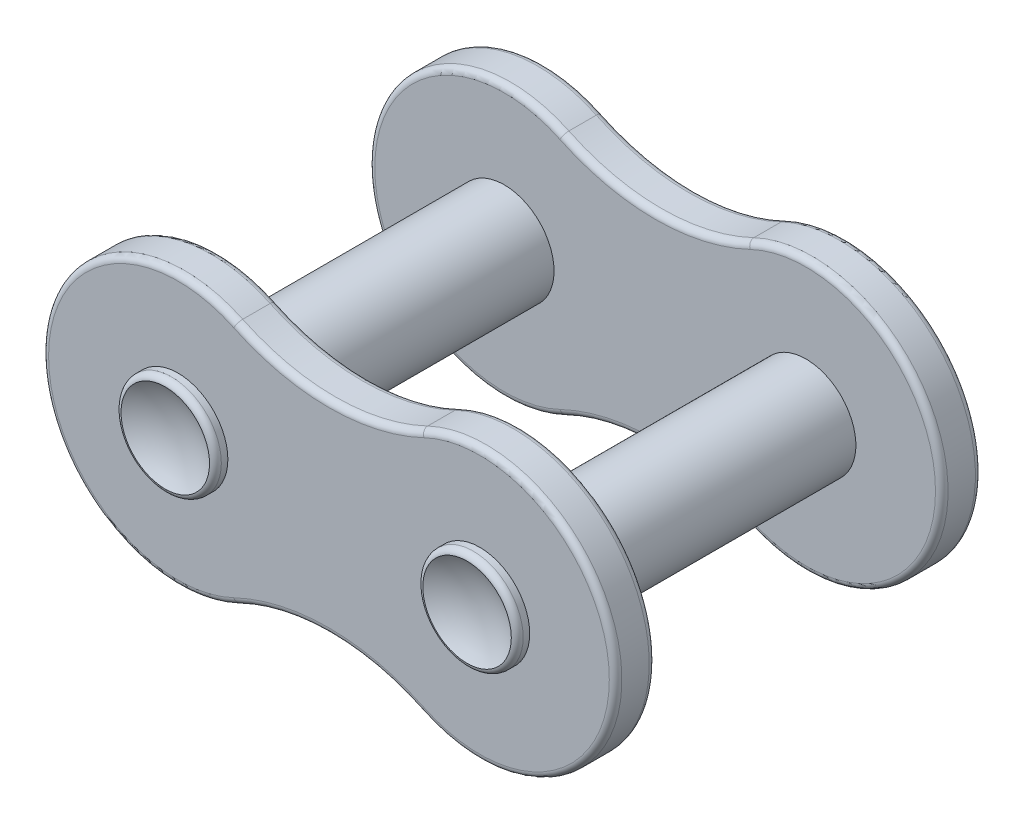
ISO-10303-21;
HEADER;
FILE_DESCRIPTION(('STEP AP214'),'2;1');
FILE_NAME('part.step','',(''),(''),'','','');
FILE_SCHEMA(('AUTOMOTIVE_DESIGN { 1 0 10303 214 1 1 1 1 }'));
ENDSEC;
DATA;
#1=APPLICATION_CONTEXT('core data for automotive mechanical design processes');
#2=APPLICATION_PROTOCOL_DEFINITION('international standard','automotive_design',2000,#1);
#3=PRODUCT_CONTEXT('',#1,'mechanical');
#4=PRODUCT('Part','Part','',(#3));
#5=PRODUCT_RELATED_PRODUCT_CATEGORY('part','',(#4));
#6=PRODUCT_DEFINITION_FORMATION('','',#4);
#7=PRODUCT_DEFINITION_CONTEXT('part definition',#1,'design');
#8=PRODUCT_DEFINITION('design','',#6,#7);
#9=PRODUCT_DEFINITION_SHAPE('','',#8);
#10=(LENGTH_UNIT() NAMED_UNIT(*) SI_UNIT(.MILLI.,.METRE.));
#11=(NAMED_UNIT(*) PLANE_ANGLE_UNIT() SI_UNIT($,.RADIAN.));
#12=(NAMED_UNIT(*) SI_UNIT($,.STERADIAN.) SOLID_ANGLE_UNIT());
#13=UNCERTAINTY_MEASURE_WITH_UNIT(LENGTH_MEASURE(1.E-05),#10,'distance_accuracy_value','');
#14=(GEOMETRIC_REPRESENTATION_CONTEXT(3) GLOBAL_UNCERTAINTY_ASSIGNED_CONTEXT((#13)) GLOBAL_UNIT_ASSIGNED_CONTEXT((#10,
#11,#12)) REPRESENTATION_CONTEXT('',''));
#15=CARTESIAN_POINT('',(0.,0.,0.));
#16=DIRECTION('',(0.,0.,1.));
#17=DIRECTION('',(1.,0.,0.));
#18=AXIS2_PLACEMENT_3D('',#15,#16,#17);
#19=CARTESIAN_POINT('',(3.,6.28966658193381,1.5875));
#20=DIRECTION('',(0.,0.,1.));
#21=DIRECTION('',(1.,0.,0.));
#22=AXIS2_PLACEMENT_3D('',#19,#20,#21);
#23=PLANE('',#22);
#24=CARTESIAN_POINT('',(-6.,0.,1.5875));
#25=DIRECTION('',(0.,0.,1.));
#26=DIRECTION('',(1.,0.,0.));
#27=AXIS2_PLACEMENT_3D('',#24,#25,#26);
#28=CIRCLE('',#27,5.1475);
#29=CARTESIAN_POINT('',(-3.78395440052328,4.64606265035674,1.5875));
#30=VERTEX_POINT('',#29);
#31=CARTESIAN_POINT('',(-3.78395440052328,-4.64606265035674,1.5875));
#32=VERTEX_POINT('',#31);
#33=EDGE_CURVE('E276',#30,#32,#28,.T.);
#34=ORIENTED_EDGE('',*,*,#33,.T.);
#35=CARTESIAN_POINT('',(0.,-12.5793331638676,1.5875));
#36=DIRECTION('',(0.,0.,1.));
#37=DIRECTION('',(1.,0.,0.));
#38=AXIS2_PLACEMENT_3D('',#35,#36,#37);
#39=CIRCLE('',#38,8.78948758152492);
#40=CARTESIAN_POINT('',(3.78395440052328,-4.64606265035674,1.5875));
#41=VERTEX_POINT('',#40);
#42=EDGE_CURVE('E278',#32,#41,#39,.F.);
#43=ORIENTED_EDGE('',*,*,#42,.T.);
#44=CARTESIAN_POINT('',(6.,0.,1.5875));
#45=DIRECTION('',(0.,0.,1.));
#46=DIRECTION('',(1.,0.,0.));
#47=AXIS2_PLACEMENT_3D('',#44,#45,#46);
#48=CIRCLE('',#47,5.1475);
#49=CARTESIAN_POINT('',(3.78395440052328,4.64606265035674,1.5875));
#50=VERTEX_POINT('',#49);
#51=EDGE_CURVE('E182',#41,#50,#48,.T.);
#52=ORIENTED_EDGE('',*,*,#51,.T.);
#53=CARTESIAN_POINT('',(0.,12.5793331638676,1.5875));
#54=DIRECTION('',(0.,0.,1.));
#55=DIRECTION('',(1.,0.,0.));
#56=AXIS2_PLACEMENT_3D('',#53,#54,#55);
#57=CIRCLE('',#56,8.78948758152492);
#58=EDGE_CURVE('E274',#50,#30,#57,.F.);
#59=ORIENTED_EDGE('',*,*,#58,.T.);
#60=EDGE_LOOP('',(#34,#43,#52,#59));
#61=FACE_BOUND('',#60,.T.);
#62=CARTESIAN_POINT('',(-6.,0.,1.5875));
#63=DIRECTION('',(0.,0.,1.));
#64=DIRECTION('',(1.,0.,0.));
#65=AXIS2_PLACEMENT_3D('',#62,#63,#64);
#66=CIRCLE('',#65,1.9812);
#67=CARTESIAN_POINT('',(-4.0188,0.,1.5875));
#68=VERTEX_POINT('',#67);
#69=EDGE_CURVE('E344',#68,#68,#66,.T.);
#70=ORIENTED_EDGE('',*,*,#69,.F.);
#71=EDGE_LOOP('',(#70));
#72=FACE_BOUND('',#71,.T.);
#73=CARTESIAN_POINT('',(6.,0.,1.5875));
#74=DIRECTION('',(0.,0.,1.));
#75=DIRECTION('',(-1.,0.,0.));
#76=AXIS2_PLACEMENT_3D('',#73,#74,#75);
#77=CIRCLE('',#76,1.9812);
#78=CARTESIAN_POINT('',(4.0188,0.,1.5875));
#79=VERTEX_POINT('',#78);
#80=EDGE_CURVE('E347',#79,#79,#77,.T.);
#81=ORIENTED_EDGE('',*,*,#80,.F.);
#82=EDGE_LOOP('',(#81));
#83=FACE_BOUND('',#82,.T.);
#84=ADVANCED_FACE('F32',(#61,#72,#83),#23,.T.);
#85=CARTESIAN_POINT('',(3.,6.28966658193381,0.));
#86=DIRECTION('',(0.,0.,1.));
#87=DIRECTION('',(1.,0.,0.));
#88=AXIS2_PLACEMENT_3D('',#85,#86,#87);
#89=PLANE('',#88);
#90=CARTESIAN_POINT('',(6.,0.,0.));
#91=DIRECTION('',(0.,0.,1.));
#92=DIRECTION('',(1.,0.,0.));
#93=AXIS2_PLACEMENT_3D('',#90,#91,#92);
#94=CIRCLE('',#93,5.1475);
#95=CARTESIAN_POINT('',(3.78395440052328,4.64606265035674,0.));
#96=VERTEX_POINT('',#95);
#97=CARTESIAN_POINT('',(3.78395440052328,-4.64606265035674,0.));
#98=VERTEX_POINT('',#97);
#99=EDGE_CURVE('E256',#96,#98,#94,.F.);
#100=ORIENTED_EDGE('',*,*,#99,.T.);
#101=CARTESIAN_POINT('',(0.,-12.5793331638676,0.));
#102=DIRECTION('',(0.,0.,1.));
#103=DIRECTION('',(1.,0.,0.));
#104=AXIS2_PLACEMENT_3D('',#101,#102,#103);
#105=CIRCLE('',#104,8.78948758152492);
#106=CARTESIAN_POINT('',(-3.78395440052328,-4.64606265035674,0.));
#107=VERTEX_POINT('',#106);
#108=EDGE_CURVE('E262',#98,#107,#105,.T.);
#109=ORIENTED_EDGE('',*,*,#108,.T.);
#110=CARTESIAN_POINT('',(-6.,0.,0.));
#111=DIRECTION('',(0.,0.,1.));
#112=DIRECTION('',(1.,0.,0.));
#113=AXIS2_PLACEMENT_3D('',#110,#111,#112);
#114=CIRCLE('',#113,5.1475);
#115=CARTESIAN_POINT('',(-3.78395440052328,4.64606265035674,0.));
#116=VERTEX_POINT('',#115);
#117=EDGE_CURVE('E260',#107,#116,#114,.F.);
#118=ORIENTED_EDGE('',*,*,#117,.T.);
#119=CARTESIAN_POINT('',(0.,12.5793331638676,0.));
#120=DIRECTION('',(0.,0.,1.));
#121=DIRECTION('',(1.,0.,0.));
#122=AXIS2_PLACEMENT_3D('',#119,#120,#121);
#123=CIRCLE('',#122,8.78948758152492);
#124=EDGE_CURVE('E258',#116,#96,#123,.T.);
#125=ORIENTED_EDGE('',*,*,#124,.T.);
#126=EDGE_LOOP('',(#100,#109,#118,#125));
#127=FACE_BOUND('',#126,.T.);
#128=CARTESIAN_POINT('',(-6.,0.,0.));
#129=DIRECTION('',(0.,0.,1.));
#130=DIRECTION('',(1.,0.,0.));
#131=AXIS2_PLACEMENT_3D('',#128,#129,#130);
#132=CIRCLE('',#131,1.9812);
#133=CARTESIAN_POINT('',(-4.0188,0.,0.));
#134=VERTEX_POINT('',#133);
#135=EDGE_CURVE('E373',#134,#134,#132,.T.);
#136=ORIENTED_EDGE('',*,*,#135,.T.);
#137=EDGE_LOOP('',(#136));
#138=FACE_BOUND('',#137,.T.);
#139=CARTESIAN_POINT('',(6.,0.,0.));
#140=DIRECTION('',(0.,0.,1.));
#141=DIRECTION('',(1.,0.,0.));
#142=AXIS2_PLACEMENT_3D('',#139,#140,#141);
#143=CIRCLE('',#142,1.9812);
#144=CARTESIAN_POINT('',(7.9812,0.,0.));
#145=VERTEX_POINT('',#144);
#146=EDGE_CURVE('E243',#145,#145,#143,.F.);
#147=ORIENTED_EDGE('',*,*,#146,.F.);
#148=EDGE_LOOP('',(#147));
#149=FACE_BOUND('',#148,.T.);
#150=ADVANCED_FACE('F332',(#127,#138,#149),#89,.F.);
#151=CARTESIAN_POINT('',(0.,12.5793331638676,1.5875));
#152=DIRECTION('',(0.,0.,-1.));
#153=DIRECTION('',(-1.,0.,0.));
#154=AXIS2_PLACEMENT_3D('',#151,#152,#153);
#155=CYLINDRICAL_SURFACE('',#154,8.53948758152492);
#156=DIRECTION('',(0.,0.,-1.));
#157=VECTOR('',#156,1.);
#158=CARTESIAN_POINT('',(3.6763271251723,4.87170920938329,1.5875));
#159=LINE('',#158,#157);
#160=CARTESIAN_POINT('',(3.6763271251723,4.87170920938329,1.3375));
#161=VERTEX_POINT('',#160);
#162=CARTESIAN_POINT('',(3.6763271251723,4.87170920938329,0.25));
#163=VERTEX_POINT('',#162);
#164=EDGE_CURVE('E151',#161,#163,#159,.T.);
#165=ORIENTED_EDGE('',*,*,#164,.T.);
#166=CARTESIAN_POINT('',(0.,12.5793331638676,0.25));
#167=DIRECTION('',(0.,0.,1.));
#168=DIRECTION('',(1.,0.,0.));
#169=AXIS2_PLACEMENT_3D('',#166,#167,#168);
#170=CIRCLE('',#169,8.53948758152492);
#171=CARTESIAN_POINT('',(-3.6763271251723,4.87170920938329,0.25));
#172=VERTEX_POINT('',#171);
#173=EDGE_CURVE('E271',#163,#172,#170,.F.);
#174=ORIENTED_EDGE('',*,*,#173,.T.);
#175=DIRECTION('',(0.,0.,-1.));
#176=VECTOR('',#175,1.);
#177=CARTESIAN_POINT('',(-3.6763271251723,4.87170920938329,1.5875));
#178=LINE('',#177,#176);
#179=CARTESIAN_POINT('',(-3.6763271251723,4.87170920938329,1.3375));
#180=VERTEX_POINT('',#179);
#181=EDGE_CURVE('E351',#180,#172,#178,.T.);
#182=ORIENTED_EDGE('',*,*,#181,.F.);
#183=CARTESIAN_POINT('',(0.,12.5793331638676,1.3375));
#184=DIRECTION('',(0.,0.,1.));
#185=DIRECTION('',(1.,0.,0.));
#186=AXIS2_PLACEMENT_3D('',#183,#184,#185);
#187=CIRCLE('',#186,8.53948758152492);
#188=EDGE_CURVE('E269',#180,#161,#187,.T.);
#189=ORIENTED_EDGE('',*,*,#188,.T.);
#190=EDGE_LOOP('',(#165,#174,#182,#189));
#191=FACE_BOUND('',#190,.T.);
#192=ADVANCED_FACE('F340',(#191),#155,.F.);
#193=CARTESIAN_POINT('',(-6.,0.,1.5875));
#194=DIRECTION('',(0.,0.,-1.));
#195=DIRECTION('',(-1.,0.,0.));
#196=AXIS2_PLACEMENT_3D('',#193,#194,#195);
#197=CYLINDRICAL_SURFACE('',#196,5.3975);
#198=ORIENTED_EDGE('',*,*,#181,.T.);
#199=CARTESIAN_POINT('',(-6.,0.,0.25));
#200=DIRECTION('',(0.,0.,1.));
#201=DIRECTION('',(1.,0.,0.));
#202=AXIS2_PLACEMENT_3D('',#199,#200,#201);
#203=CIRCLE('',#202,5.3975);
#204=CARTESIAN_POINT('',(-3.6763271251723,-4.87170920938329,0.25));
#205=VERTEX_POINT('',#204);
#206=EDGE_CURVE('E267',#172,#205,#203,.T.);
#207=ORIENTED_EDGE('',*,*,#206,.T.);
#208=DIRECTION('',(0.,0.,-1.));
#209=VECTOR('',#208,1.);
#210=CARTESIAN_POINT('',(-3.6763271251723,-4.87170920938329,1.5875));
#211=LINE('',#210,#209);
#212=CARTESIAN_POINT('',(-3.6763271251723,-4.87170920938329,1.3375));
#213=VERTEX_POINT('',#212);
#214=EDGE_CURVE('E169',#213,#205,#211,.T.);
#215=ORIENTED_EDGE('',*,*,#214,.F.);
#216=CARTESIAN_POINT('',(-6.,0.,1.3375));
#217=DIRECTION('',(0.,0.,1.));
#218=DIRECTION('',(1.,0.,0.));
#219=AXIS2_PLACEMENT_3D('',#216,#217,#218);
#220=CIRCLE('',#219,5.3975);
#221=EDGE_CURVE('E265',#213,#180,#220,.F.);
#222=ORIENTED_EDGE('',*,*,#221,.T.);
#223=EDGE_LOOP('',(#198,#207,#215,#222));
#224=FACE_BOUND('',#223,.T.);
#225=ADVANCED_FACE('F446',(#224),#197,.T.);
#226=CARTESIAN_POINT('',(0.,-12.5793331638676,1.5875));
#227=DIRECTION('',(0.,0.,-1.));
#228=DIRECTION('',(-1.,0.,0.));
#229=AXIS2_PLACEMENT_3D('',#226,#227,#228);
#230=CYLINDRICAL_SURFACE('',#229,8.53948758152492);
#231=ORIENTED_EDGE('',*,*,#214,.T.);
#232=CARTESIAN_POINT('',(0.,-12.5793331638676,0.25));
#233=DIRECTION('',(0.,0.,1.));
#234=DIRECTION('',(1.,0.,0.));
#235=AXIS2_PLACEMENT_3D('',#232,#233,#234);
#236=CIRCLE('',#235,8.53948758152492);
#237=CARTESIAN_POINT('',(3.6763271251723,-4.87170920938329,0.25));
#238=VERTEX_POINT('',#237);
#239=EDGE_CURVE('E168',#205,#238,#236,.F.);
#240=ORIENTED_EDGE('',*,*,#239,.T.);
#241=DIRECTION('',(0.,0.,-1.));
#242=VECTOR('',#241,1.);
#243=CARTESIAN_POINT('',(3.6763271251723,-4.87170920938329,1.5875));
#244=LINE('',#243,#242);
#245=CARTESIAN_POINT('',(3.6763271251723,-4.87170920938329,1.3375));
#246=VERTEX_POINT('',#245);
#247=EDGE_CURVE('E149',#246,#238,#244,.T.);
#248=ORIENTED_EDGE('',*,*,#247,.F.);
#249=CARTESIAN_POINT('',(0.,-12.5793331638676,1.3375));
#250=DIRECTION('',(0.,0.,1.));
#251=DIRECTION('',(1.,0.,0.));
#252=AXIS2_PLACEMENT_3D('',#249,#250,#251);
#253=CIRCLE('',#252,8.53948758152492);
#254=EDGE_CURVE('E165',#246,#213,#253,.T.);
#255=ORIENTED_EDGE('',*,*,#254,.T.);
#256=EDGE_LOOP('',(#231,#240,#248,#255));
#257=FACE_BOUND('',#256,.T.);
#258=ADVANCED_FACE('F164',(#257),#230,.F.);
#259=CARTESIAN_POINT('',(6.,0.,1.5875));
#260=DIRECTION('',(0.,0.,-1.));
#261=DIRECTION('',(-1.,0.,0.));
#262=AXIS2_PLACEMENT_3D('',#259,#260,#261);
#263=CYLINDRICAL_SURFACE('',#262,5.3975);
#264=ORIENTED_EDGE('',*,*,#247,.T.);
#265=CARTESIAN_POINT('',(6.,0.,0.25));
#266=DIRECTION('',(0.,0.,1.));
#267=DIRECTION('',(1.,0.,0.));
#268=AXIS2_PLACEMENT_3D('',#265,#266,#267);
#269=CIRCLE('',#268,5.3975);
#270=EDGE_CURVE('E156',#238,#163,#269,.T.);
#271=ORIENTED_EDGE('',*,*,#270,.T.);
#272=ORIENTED_EDGE('',*,*,#164,.F.);
#273=CARTESIAN_POINT('',(6.,0.,1.3375));
#274=DIRECTION('',(0.,0.,1.));
#275=DIRECTION('',(1.,0.,0.));
#276=AXIS2_PLACEMENT_3D('',#273,#274,#275);
#277=CIRCLE('',#276,5.3975);
#278=EDGE_CURVE('E146',#161,#246,#277,.F.);
#279=ORIENTED_EDGE('',*,*,#278,.T.);
#280=EDGE_LOOP('',(#264,#271,#272,#279));
#281=FACE_BOUND('',#280,.T.);
#282=ADVANCED_FACE('F148',(#281),#263,.T.);
#283=CARTESIAN_POINT('',(-6.,0.,-0.508));
#284=DIRECTION('',(0.,0.,1.));
#285=DIRECTION('',(1.,0.,0.));
#286=AXIS2_PLACEMENT_3D('',#283,#284,#285);
#287=CYLINDRICAL_SURFACE('',#286,1.9812);
#288=CARTESIAN_POINT('',(-6.,0.,-0.259637121162392));
#289=DIRECTION('',(0.,0.,-1.));
#290=DIRECTION('',(-1.,0.,0.));
#291=AXIS2_PLACEMENT_3D('',#288,#289,#290);
#292=CIRCLE('',#291,1.9812);
#293=CARTESIAN_POINT('',(-7.9812,0.,-0.259637121162392));
#294=VERTEX_POINT('',#293);
#295=EDGE_CURVE('E216',#294,#294,#292,.F.);
#296=ORIENTED_EDGE('',*,*,#295,.T.);
#297=EDGE_LOOP('',(#296));
#298=FACE_BOUND('',#297,.T.);
#299=ORIENTED_EDGE('',*,*,#135,.F.);
#300=EDGE_LOOP('',(#299));
#301=FACE_BOUND('',#300,.T.);
#302=ADVANCED_FACE('F362',(#298,#301),#287,.T.);
#303=CARTESIAN_POINT('',(-6.,0.,12.969748));
#304=DIRECTION('',(0.,0.,-1.));
#305=DIRECTION('',(-1.,0.,0.));
#306=AXIS2_PLACEMENT_3D('',#303,#304,#305);
#307=CIRCLE('',#306,1.9812);
#308=CARTESIAN_POINT('',(-7.9812,0.,12.969748));
#309=VERTEX_POINT('',#308);
#310=EDGE_CURVE('E179',#309,#309,#307,.F.);
#311=ORIENTED_EDGE('',*,*,#310,.F.);
#312=EDGE_LOOP('',(#311));
#313=FACE_BOUND('',#312,.T.);
#314=ORIENTED_EDGE('',*,*,#69,.T.);
#315=EDGE_LOOP('',(#314));
#316=FACE_BOUND('',#315,.T.);
#317=ADVANCED_FACE('F358',(#313,#316),#287,.T.);
#318=CARTESIAN_POINT('',(0.,12.5793331638676,12.969748));
#319=DIRECTION('',(0.,0.,1.));
#320=DIRECTION('',(1.,0.,0.));
#321=AXIS2_PLACEMENT_3D('',#318,#319,#320);
#322=CYLINDRICAL_SURFACE('',#321,8.53948758152492);
#323=DIRECTION('',(0.,0.,1.));
#324=VECTOR('',#323,1.);
#325=CARTESIAN_POINT('',(3.6763271251723,4.87170920938329,12.969748));
#326=LINE('',#325,#324);
#327=CARTESIAN_POINT('',(3.6763271251723,4.87170920938329,13.219748));
#328=VERTEX_POINT('',#327);
#329=CARTESIAN_POINT('',(3.6763271251723,4.87170920938329,14.307248));
#330=VERTEX_POINT('',#329);
#331=EDGE_CURVE('E375',#328,#330,#326,.T.);
#332=ORIENTED_EDGE('',*,*,#331,.F.);
#333=CARTESIAN_POINT('',(0.,12.5793331638676,13.219748));
#334=DIRECTION('',(0.,0.,-1.));
#335=DIRECTION('',(-1.,0.,0.));
#336=AXIS2_PLACEMENT_3D('',#333,#334,#335);
#337=CIRCLE('',#336,8.53948758152492);
#338=CARTESIAN_POINT('',(-3.6763271251723,4.87170920938329,13.219748));
#339=VERTEX_POINT('',#338);
#340=EDGE_CURVE('E301',#328,#339,#337,.T.);
#341=ORIENTED_EDGE('',*,*,#340,.T.);
#342=DIRECTION('',(0.,0.,1.));
#343=VECTOR('',#342,1.);
#344=CARTESIAN_POINT('',(-3.6763271251723,4.87170920938329,12.969748));
#345=LINE('',#344,#343);
#346=CARTESIAN_POINT('',(-3.6763271251723,4.87170920938329,14.307248));
#347=VERTEX_POINT('',#346);
#348=EDGE_CURVE('E386',#339,#347,#345,.T.);
#349=ORIENTED_EDGE('',*,*,#348,.T.);
#350=CARTESIAN_POINT('',(0.,12.5793331638676,14.307248));
#351=DIRECTION('',(0.,0.,-1.));
#352=DIRECTION('',(-1.,0.,0.));
#353=AXIS2_PLACEMENT_3D('',#350,#351,#352);
#354=CIRCLE('',#353,8.53948758152492);
#355=EDGE_CURVE('E299',#347,#330,#354,.F.);
#356=ORIENTED_EDGE('',*,*,#355,.T.);
#357=EDGE_LOOP('',(#332,#341,#349,#356));
#358=FACE_BOUND('',#357,.T.);
#359=ADVANCED_FACE('F361',(#358),#322,.F.);
#360=CARTESIAN_POINT('',(6.,0.,12.969748));
#361=DIRECTION('',(0.,0.,1.));
#362=DIRECTION('',(1.,0.,0.));
#363=AXIS2_PLACEMENT_3D('',#360,#361,#362);
#364=CYLINDRICAL_SURFACE('',#363,5.3975);
#365=DIRECTION('',(0.,0.,1.));
#366=VECTOR('',#365,1.);
#367=CARTESIAN_POINT('',(3.6763271251723,-4.87170920938329,12.969748));
#368=LINE('',#367,#366);
#369=CARTESIAN_POINT('',(3.6763271251723,-4.87170920938329,13.219748));
#370=VERTEX_POINT('',#369);
#371=CARTESIAN_POINT('',(3.6763271251723,-4.87170920938329,14.307248));
#372=VERTEX_POINT('',#371);
#373=EDGE_CURVE('E380',#370,#372,#368,.T.);
#374=ORIENTED_EDGE('',*,*,#373,.F.);
#375=CARTESIAN_POINT('',(6.,0.,13.219748));
#376=DIRECTION('',(0.,0.,-1.));
#377=DIRECTION('',(-1.,0.,0.));
#378=AXIS2_PLACEMENT_3D('',#375,#376,#377);
#379=CIRCLE('',#378,5.3975);
#380=EDGE_CURVE('E220',#370,#328,#379,.F.);
#381=ORIENTED_EDGE('',*,*,#380,.T.);
#382=ORIENTED_EDGE('',*,*,#331,.T.);
#383=CARTESIAN_POINT('',(6.,0.,14.307248));
#384=DIRECTION('',(0.,0.,-1.));
#385=DIRECTION('',(-1.,0.,0.));
#386=AXIS2_PLACEMENT_3D('',#383,#384,#385);
#387=CIRCLE('',#386,5.3975);
#388=EDGE_CURVE('E309',#330,#372,#387,.T.);
#389=ORIENTED_EDGE('',*,*,#388,.T.);
#390=EDGE_LOOP('',(#374,#381,#382,#389));
#391=FACE_BOUND('',#390,.T.);
#392=ADVANCED_FACE('F432',(#391),#364,.T.);
#393=CARTESIAN_POINT('',(0.,-12.5793331638676,12.969748));
#394=DIRECTION('',(0.,0.,1.));
#395=DIRECTION('',(1.,0.,0.));
#396=AXIS2_PLACEMENT_3D('',#393,#394,#395);
#397=CYLINDRICAL_SURFACE('',#396,8.53948758152492);
#398=DIRECTION('',(0.,0.,1.));
#399=VECTOR('',#398,1.);
#400=CARTESIAN_POINT('',(-3.6763271251723,-4.87170920938329,12.969748));
#401=LINE('',#400,#399);
#402=CARTESIAN_POINT('',(-3.6763271251723,-4.87170920938329,13.219748));
#403=VERTEX_POINT('',#402);
#404=CARTESIAN_POINT('',(-3.6763271251723,-4.87170920938329,14.307248));
#405=VERTEX_POINT('',#404);
#406=EDGE_CURVE('E383',#403,#405,#401,.T.);
#407=ORIENTED_EDGE('',*,*,#406,.F.);
#408=CARTESIAN_POINT('',(0.,-12.5793331638676,13.219748));
#409=DIRECTION('',(0.,0.,-1.));
#410=DIRECTION('',(-1.,0.,0.));
#411=AXIS2_PLACEMENT_3D('',#408,#409,#410);
#412=CIRCLE('',#411,8.53948758152492);
#413=EDGE_CURVE('E283',#403,#370,#412,.T.);
#414=ORIENTED_EDGE('',*,*,#413,.T.);
#415=ORIENTED_EDGE('',*,*,#373,.T.);
#416=CARTESIAN_POINT('',(0.,-12.5793331638676,14.307248));
#417=DIRECTION('',(0.,0.,-1.));
#418=DIRECTION('',(-1.,0.,0.));
#419=AXIS2_PLACEMENT_3D('',#416,#417,#418);
#420=CIRCLE('',#419,8.53948758152492);
#421=EDGE_CURVE('E280',#372,#405,#420,.F.);
#422=ORIENTED_EDGE('',*,*,#421,.T.);
#423=EDGE_LOOP('',(#407,#414,#415,#422));
#424=FACE_BOUND('',#423,.T.);
#425=ADVANCED_FACE('F428',(#424),#397,.F.);
#426=CARTESIAN_POINT('',(-6.,0.,12.969748));
#427=DIRECTION('',(0.,0.,1.));
#428=DIRECTION('',(1.,0.,0.));
#429=AXIS2_PLACEMENT_3D('',#426,#427,#428);
#430=CYLINDRICAL_SURFACE('',#429,5.3975);
#431=ORIENTED_EDGE('',*,*,#348,.F.);
#432=CARTESIAN_POINT('',(-6.,0.,13.219748));
#433=DIRECTION('',(0.,0.,-1.));
#434=DIRECTION('',(-1.,0.,0.));
#435=AXIS2_PLACEMENT_3D('',#432,#433,#434);
#436=CIRCLE('',#435,5.3975);
#437=EDGE_CURVE('E297',#339,#403,#436,.F.);
#438=ORIENTED_EDGE('',*,*,#437,.T.);
#439=ORIENTED_EDGE('',*,*,#406,.T.);
#440=CARTESIAN_POINT('',(-6.,0.,14.307248));
#441=DIRECTION('',(0.,0.,-1.));
#442=DIRECTION('',(-1.,0.,0.));
#443=AXIS2_PLACEMENT_3D('',#440,#441,#442);
#444=CIRCLE('',#443,5.3975);
#445=EDGE_CURVE('E295',#405,#347,#444,.T.);
#446=ORIENTED_EDGE('',*,*,#445,.T.);
#447=EDGE_LOOP('',(#431,#438,#439,#446));
#448=FACE_BOUND('',#447,.T.);
#449=ADVANCED_FACE('F422',(#448),#430,.T.);
#450=CARTESIAN_POINT('',(3.,6.28966658193381,12.969748));
#451=DIRECTION('',(0.,0.,-1.));
#452=DIRECTION('',(1.,0.,0.));
#453=AXIS2_PLACEMENT_3D('',#450,#451,#452);
#454=PLANE('',#453);
#455=CARTESIAN_POINT('',(6.,0.,12.969748));
#456=DIRECTION('',(0.,0.,-1.));
#457=DIRECTION('',(-1.,0.,0.));
#458=AXIS2_PLACEMENT_3D('',#455,#456,#457);
#459=CIRCLE('',#458,5.1475);
#460=CARTESIAN_POINT('',(3.78395440052328,4.64606265035674,12.969748));
#461=VERTEX_POINT('',#460);
#462=CARTESIAN_POINT('',(3.78395440052328,-4.64606265035674,12.969748));
#463=VERTEX_POINT('',#462);
#464=EDGE_CURVE('E286',#461,#463,#459,.T.);
#465=ORIENTED_EDGE('',*,*,#464,.T.);
#466=CARTESIAN_POINT('',(0.,-12.5793331638676,12.969748));
#467=DIRECTION('',(0.,0.,-1.));
#468=DIRECTION('',(-1.,0.,0.));
#469=AXIS2_PLACEMENT_3D('',#466,#467,#468);
#470=CIRCLE('',#469,8.78948758152492);
#471=CARTESIAN_POINT('',(-3.78395440052328,-4.64606265035674,12.969748));
#472=VERTEX_POINT('',#471);
#473=EDGE_CURVE('E292',#463,#472,#470,.F.);
#474=ORIENTED_EDGE('',*,*,#473,.T.);
#475=CARTESIAN_POINT('',(-6.,0.,12.969748));
#476=DIRECTION('',(0.,0.,-1.));
#477=DIRECTION('',(-1.,0.,0.));
#478=AXIS2_PLACEMENT_3D('',#475,#476,#477);
#479=CIRCLE('',#478,5.1475);
#480=CARTESIAN_POINT('',(-3.78395440052328,4.64606265035674,12.969748));
#481=VERTEX_POINT('',#480);
#482=EDGE_CURVE('E290',#472,#481,#479,.T.);
#483=ORIENTED_EDGE('',*,*,#482,.T.);
#484=CARTESIAN_POINT('',(0.,12.5793331638676,12.969748));
#485=DIRECTION('',(0.,0.,-1.));
#486=DIRECTION('',(-1.,0.,0.));
#487=AXIS2_PLACEMENT_3D('',#484,#485,#486);
#488=CIRCLE('',#487,8.78948758152492);
#489=EDGE_CURVE('E288',#481,#461,#488,.F.);
#490=ORIENTED_EDGE('',*,*,#489,.T.);
#491=EDGE_LOOP('',(#465,#474,#483,#490));
#492=FACE_BOUND('',#491,.T.);
#493=CARTESIAN_POINT('',(6.,0.,12.969748));
#494=DIRECTION('',(0.,0.,-1.));
#495=DIRECTION('',(-1.,0.,0.));
#496=AXIS2_PLACEMENT_3D('',#493,#494,#495);
#497=CIRCLE('',#496,1.9812);
#498=CARTESIAN_POINT('',(4.0188,0.,12.969748));
#499=VERTEX_POINT('',#498);
#500=EDGE_CURVE('E251',#499,#499,#497,.F.);
#501=ORIENTED_EDGE('',*,*,#500,.T.);
#502=EDGE_LOOP('',(#501));
#503=FACE_BOUND('',#502,.T.);
#504=ORIENTED_EDGE('',*,*,#310,.T.);
#505=EDGE_LOOP('',(#504));
#506=FACE_BOUND('',#505,.T.);
#507=ADVANCED_FACE('F356',(#492,#503,#506),#454,.T.);
#508=CARTESIAN_POINT('',(3.,6.28966658193381,14.557248));
#509=DIRECTION('',(0.,0.,-1.));
#510=DIRECTION('',(1.,0.,0.));
#511=AXIS2_PLACEMENT_3D('',#508,#509,#510);
#512=PLANE('',#511);
#513=CARTESIAN_POINT('',(-6.,0.,14.557248));
#514=DIRECTION('',(0.,0.,-1.));
#515=DIRECTION('',(-1.,0.,0.));
#516=AXIS2_PLACEMENT_3D('',#513,#514,#515);
#517=CIRCLE('',#516,5.1475);
#518=CARTESIAN_POINT('',(-3.78395440052328,4.64606265035674,14.557248));
#519=VERTEX_POINT('',#518);
#520=CARTESIAN_POINT('',(-3.78395440052328,-4.64606265035674,14.557248));
#521=VERTEX_POINT('',#520);
#522=EDGE_CURVE('E47',#519,#521,#517,.F.);
#523=ORIENTED_EDGE('',*,*,#522,.T.);
#524=CARTESIAN_POINT('',(0.,-12.5793331638676,14.557248));
#525=DIRECTION('',(0.,0.,-1.));
#526=DIRECTION('',(-1.,0.,0.));
#527=AXIS2_PLACEMENT_3D('',#524,#525,#526);
#528=CIRCLE('',#527,8.78948758152492);
#529=CARTESIAN_POINT('',(3.78395440052328,-4.64606265035674,14.557248));
#530=VERTEX_POINT('',#529);
#531=EDGE_CURVE('E157',#521,#530,#528,.T.);
#532=ORIENTED_EDGE('',*,*,#531,.T.);
#533=CARTESIAN_POINT('',(6.,0.,14.557248));
#534=DIRECTION('',(0.,0.,-1.));
#535=DIRECTION('',(-1.,0.,0.));
#536=AXIS2_PLACEMENT_3D('',#533,#534,#535);
#537=CIRCLE('',#536,5.1475);
#538=CARTESIAN_POINT('',(3.78395440052328,4.64606265035674,14.557248));
#539=VERTEX_POINT('',#538);
#540=EDGE_CURVE('E303',#530,#539,#537,.F.);
#541=ORIENTED_EDGE('',*,*,#540,.T.);
#542=CARTESIAN_POINT('',(0.,12.5793331638676,14.557248));
#543=DIRECTION('',(0.,0.,-1.));
#544=DIRECTION('',(-1.,0.,0.));
#545=AXIS2_PLACEMENT_3D('',#542,#543,#544);
#546=CIRCLE('',#545,8.78948758152492);
#547=EDGE_CURVE('E52',#539,#519,#546,.T.);
#548=ORIENTED_EDGE('',*,*,#547,.T.);
#549=EDGE_LOOP('',(#523,#532,#541,#548));
#550=FACE_BOUND('',#549,.T.);
#551=CARTESIAN_POINT('',(6.,0.,14.557248));
#552=DIRECTION('',(0.,0.,1.));
#553=DIRECTION('',(-1.,0.,0.));
#554=AXIS2_PLACEMENT_3D('',#551,#552,#553);
#555=CIRCLE('',#554,1.9812);
#556=CARTESIAN_POINT('',(4.0188,0.,14.557248));
#557=VERTEX_POINT('',#556);
#558=EDGE_CURVE('E236',#557,#557,#555,.T.);
#559=ORIENTED_EDGE('',*,*,#558,.F.);
#560=EDGE_LOOP('',(#559));
#561=FACE_BOUND('',#560,.T.);
#562=CARTESIAN_POINT('',(-6.,0.,14.557248));
#563=DIRECTION('',(0.,0.,1.));
#564=DIRECTION('',(1.,0.,0.));
#565=AXIS2_PLACEMENT_3D('',#562,#563,#564);
#566=CIRCLE('',#565,1.9812);
#567=CARTESIAN_POINT('',(-4.0188,0.,14.557248));
#568=VERTEX_POINT('',#567);
#569=EDGE_CURVE('E240',#568,#568,#566,.T.);
#570=ORIENTED_EDGE('',*,*,#569,.F.);
#571=EDGE_LOOP('',(#570));
#572=FACE_BOUND('',#571,.T.);
#573=ADVANCED_FACE('F421',(#550,#561,#572),#512,.F.);
#574=CARTESIAN_POINT('',(-6.,0.,14.8168851211624));
#575=DIRECTION('',(0.,0.,1.));
#576=DIRECTION('',(1.,0.,0.));
#577=AXIS2_PLACEMENT_3D('',#574,#575,#576);
#578=CIRCLE('',#577,1.9812);
#579=CARTESIAN_POINT('',(-4.0188,0.,14.8168851211624));
#580=VERTEX_POINT('',#579);
#581=EDGE_CURVE('E40',#580,#580,#578,.F.);
#582=ORIENTED_EDGE('',*,*,#581,.T.);
#583=EDGE_LOOP('',(#582));
#584=FACE_BOUND('',#583,.T.);
#585=ORIENTED_EDGE('',*,*,#569,.T.);
#586=EDGE_LOOP('',(#585));
#587=FACE_BOUND('',#586,.T.);
#588=ADVANCED_FACE('F225',(#584,#587),#287,.T.);
#589=CARTESIAN_POINT('',(-6.,0.,17.859248));
#590=DIRECTION('',(0.,0.,-1.));
#591=DIRECTION('',(-1.,0.,0.));
#592=AXIS2_PLACEMENT_3D('',#589,#590,#591);
#593=SPHERICAL_SURFACE('',#592,3.302);
#594=CARTESIAN_POINT('',(-6.,0.,15.065248));
#595=DIRECTION('',(0.,0.,1.));
#596=DIRECTION('',(1.,0.,0.));
#597=AXIS2_PLACEMENT_3D('',#594,#595,#596);
#598=CIRCLE('',#597,1.75976362048998);
#599=CARTESIAN_POINT('',(-4.24023637951002,0.,15.065248));
#600=VERTEX_POINT('',#599);
#601=EDGE_CURVE('E234',#600,#600,#598,.T.);
#602=ORIENTED_EDGE('',*,*,#601,.T.);
#603=EDGE_LOOP('',(#602));
#604=FACE_BOUND('',#603,.T.);
#605=ADVANCED_FACE('F415',(#604),#593,.F.);
#606=CARTESIAN_POINT('',(-6.,0.,-3.302));
#607=DIRECTION('',(0.,0.,1.));
#608=DIRECTION('',(-1.,0.,0.));
#609=AXIS2_PLACEMENT_3D('',#606,#607,#608);
#610=SPHERICAL_SURFACE('',#609,3.302);
#611=CARTESIAN_POINT('',(-6.,0.,-0.508));
#612=DIRECTION('',(0.,0.,1.));
#613=DIRECTION('',(1.,0.,0.));
#614=AXIS2_PLACEMENT_3D('',#611,#612,#613);
#615=CIRCLE('',#614,1.75976362048998);
#616=CARTESIAN_POINT('',(-4.24023637951002,0.,-0.508));
#617=VERTEX_POINT('',#616);
#618=EDGE_CURVE('E237',#617,#617,#615,.T.);
#619=ORIENTED_EDGE('',*,*,#618,.F.);
#620=EDGE_LOOP('',(#619));
#621=FACE_BOUND('',#620,.T.);
#622=ADVANCED_FACE('F408',(#621),#610,.F.);
#623=CARTESIAN_POINT('',(6.,0.,-0.508));
#624=DIRECTION('',(0.,0.,1.));
#625=DIRECTION('',(1.,0.,0.));
#626=AXIS2_PLACEMENT_3D('',#623,#624,#625);
#627=CYLINDRICAL_SURFACE('',#626,1.9812);
#628=CARTESIAN_POINT('',(6.,0.,14.8168851211624));
#629=DIRECTION('',(0.,0.,1.));
#630=DIRECTION('',(1.,0.,0.));
#631=AXIS2_PLACEMENT_3D('',#628,#629,#630);
#632=CIRCLE('',#631,1.9812);
#633=CARTESIAN_POINT('',(7.9812,0.,14.8168851211624));
#634=VERTEX_POINT('',#633);
#635=EDGE_CURVE('E11',#634,#634,#632,.F.);
#636=ORIENTED_EDGE('',*,*,#635,.T.);
#637=EDGE_LOOP('',(#636));
#638=FACE_BOUND('',#637,.T.);
#639=ORIENTED_EDGE('',*,*,#558,.T.);
#640=EDGE_LOOP('',(#639));
#641=FACE_BOUND('',#640,.T.);
#642=ADVANCED_FACE('F400',(#638,#641),#627,.T.);
#643=ORIENTED_EDGE('',*,*,#80,.T.);
#644=EDGE_LOOP('',(#643));
#645=FACE_BOUND('',#644,.T.);
#646=ORIENTED_EDGE('',*,*,#500,.F.);
#647=EDGE_LOOP('',(#646));
#648=FACE_BOUND('',#647,.T.);
#649=ADVANCED_FACE('F397',(#645,#648),#627,.T.);
#650=CARTESIAN_POINT('',(6.,0.,-0.259637121162392));
#651=DIRECTION('',(0.,0.,-1.));
#652=DIRECTION('',(-1.,0.,0.));
#653=AXIS2_PLACEMENT_3D('',#650,#651,#652);
#654=CIRCLE('',#653,1.9812);
#655=CARTESIAN_POINT('',(4.0188,0.,-0.259637121162392));
#656=VERTEX_POINT('',#655);
#657=EDGE_CURVE('E219',#656,#656,#654,.F.);
#658=ORIENTED_EDGE('',*,*,#657,.T.);
#659=EDGE_LOOP('',(#658));
#660=FACE_BOUND('',#659,.T.);
#661=ORIENTED_EDGE('',*,*,#146,.T.);
#662=EDGE_LOOP('',(#661));
#663=FACE_BOUND('',#662,.T.);
#664=ADVANCED_FACE('F399',(#660,#663),#627,.T.);
#665=CARTESIAN_POINT('',(6.,0.,17.859248));
#666=DIRECTION('',(0.,0.,-1.));
#667=DIRECTION('',(1.,0.,0.));
#668=AXIS2_PLACEMENT_3D('',#665,#666,#667);
#669=SPHERICAL_SURFACE('',#668,3.302);
#670=CARTESIAN_POINT('',(6.,0.,15.065248));
#671=DIRECTION('',(0.,0.,1.));
#672=DIRECTION('',(1.,0.,0.));
#673=AXIS2_PLACEMENT_3D('',#670,#671,#672);
#674=CIRCLE('',#673,1.75976362048998);
#675=CARTESIAN_POINT('',(7.75976362048998,0.,15.065248));
#676=VERTEX_POINT('',#675);
#677=EDGE_CURVE('E248',#676,#676,#674,.T.);
#678=ORIENTED_EDGE('',*,*,#677,.T.);
#679=EDGE_LOOP('',(#678));
#680=FACE_BOUND('',#679,.T.);
#681=ADVANCED_FACE('F406',(#680),#669,.F.);
#682=CARTESIAN_POINT('',(6.,0.,-3.302));
#683=DIRECTION('',(0.,0.,1.));
#684=DIRECTION('',(1.,0.,0.));
#685=AXIS2_PLACEMENT_3D('',#682,#683,#684);
#686=SPHERICAL_SURFACE('',#685,3.302);
#687=CARTESIAN_POINT('',(6.,0.,-0.508));
#688=DIRECTION('',(0.,0.,1.));
#689=DIRECTION('',(1.,0.,0.));
#690=AXIS2_PLACEMENT_3D('',#687,#688,#689);
#691=CIRCLE('',#690,1.75976362048998);
#692=CARTESIAN_POINT('',(7.75976362048998,0.,-0.508));
#693=VERTEX_POINT('',#692);
#694=EDGE_CURVE('E252',#693,#693,#691,.T.);
#695=ORIENTED_EDGE('',*,*,#694,.F.);
#696=EDGE_LOOP('',(#695));
#697=FACE_BOUND('',#696,.T.);
#698=ADVANCED_FACE('F460',(#697),#686,.F.);
#699=CARTESIAN_POINT('',(0.,12.5793331638676,0.25));
#700=DIRECTION('',(0.,0.,1.));
#701=DIRECTION('',(1.,0.,0.));
#702=AXIS2_PLACEMENT_3D('',#699,#700,#701);
#703=TOROIDAL_SURFACE('',#702,8.78948758152492,0.25);
#704=CARTESIAN_POINT('',(3.78395440052328,4.64606265035674,0.25));
#705=DIRECTION('',(0.902586236106214,0.430509101403927,0.));
#706=DIRECTION('',(-0.430509101403927,0.902586236106214,0.));
#707=AXIS2_PLACEMENT_3D('',#704,#705,#706);
#708=CIRCLE('',#707,0.25);
#709=EDGE_CURVE('E314',#96,#163,#708,.T.);
#710=ORIENTED_EDGE('',*,*,#709,.F.);
#711=ORIENTED_EDGE('',*,*,#124,.F.);
#712=CARTESIAN_POINT('',(-3.78395440052328,4.64606265035674,0.25));
#713=DIRECTION('',(-0.902586236106214,0.430509101403927,0.));
#714=DIRECTION('',(-0.430509101403927,-0.902586236106214,0.));
#715=AXIS2_PLACEMENT_3D('',#712,#713,#714);
#716=CIRCLE('',#715,0.25);
#717=EDGE_CURVE('E192',#172,#116,#716,.T.);
#718=ORIENTED_EDGE('',*,*,#717,.F.);
#719=ORIENTED_EDGE('',*,*,#173,.F.);
#720=EDGE_LOOP('',(#710,#711,#718,#719));
#721=FACE_BOUND('',#720,.T.);
#722=ADVANCED_FACE('F330',(#721),#703,.T.);
#723=CARTESIAN_POINT('',(-6.,0.,0.25));
#724=DIRECTION('',(0.,0.,1.));
#725=DIRECTION('',(1.,0.,0.));
#726=AXIS2_PLACEMENT_3D('',#723,#724,#725);
#727=TOROIDAL_SURFACE('',#726,5.1475,0.25);
#728=ORIENTED_EDGE('',*,*,#717,.T.);
#729=ORIENTED_EDGE('',*,*,#117,.F.);
#730=CARTESIAN_POINT('',(-3.78395440052328,-4.64606265035674,0.25));
#731=DIRECTION('',(0.902586236106214,0.430509101403927,0.));
#732=DIRECTION('',(-0.430509101403927,0.902586236106214,0.));
#733=AXIS2_PLACEMENT_3D('',#730,#731,#732);
#734=CIRCLE('',#733,0.25);
#735=EDGE_CURVE('E313',#205,#107,#734,.T.);
#736=ORIENTED_EDGE('',*,*,#735,.F.);
#737=ORIENTED_EDGE('',*,*,#206,.F.);
#738=EDGE_LOOP('',(#728,#729,#736,#737));
#739=FACE_BOUND('',#738,.T.);
#740=ADVANCED_FACE('F325',(#739),#727,.T.);
#741=CARTESIAN_POINT('',(6.,0.,0.25));
#742=DIRECTION('',(0.,0.,1.));
#743=DIRECTION('',(1.,0.,0.));
#744=AXIS2_PLACEMENT_3D('',#741,#742,#743);
#745=TOROIDAL_SURFACE('',#744,5.1475,0.25);
#746=ORIENTED_EDGE('',*,*,#709,.T.);
#747=ORIENTED_EDGE('',*,*,#270,.F.);
#748=CARTESIAN_POINT('',(3.78395440052328,-4.64606265035674,0.25));
#749=DIRECTION('',(-0.902586236106214,0.430509101403927,0.));
#750=DIRECTION('',(-0.430509101403927,-0.902586236106214,0.));
#751=AXIS2_PLACEMENT_3D('',#748,#749,#750);
#752=CIRCLE('',#751,0.25);
#753=EDGE_CURVE('E199',#98,#238,#752,.T.);
#754=ORIENTED_EDGE('',*,*,#753,.F.);
#755=ORIENTED_EDGE('',*,*,#99,.F.);
#756=EDGE_LOOP('',(#746,#747,#754,#755));
#757=FACE_BOUND('',#756,.T.);
#758=ADVANCED_FACE('F338',(#757),#745,.T.);
#759=CARTESIAN_POINT('',(0.,-12.5793331638676,0.25));
#760=DIRECTION('',(0.,0.,1.));
#761=DIRECTION('',(1.,0.,0.));
#762=AXIS2_PLACEMENT_3D('',#759,#760,#761);
#763=TOROIDAL_SURFACE('',#762,8.78948758152492,0.25);
#764=ORIENTED_EDGE('',*,*,#735,.T.);
#765=ORIENTED_EDGE('',*,*,#108,.F.);
#766=ORIENTED_EDGE('',*,*,#753,.T.);
#767=ORIENTED_EDGE('',*,*,#239,.F.);
#768=EDGE_LOOP('',(#764,#765,#766,#767));
#769=FACE_BOUND('',#768,.T.);
#770=ADVANCED_FACE('F337',(#769),#763,.T.);
#771=CARTESIAN_POINT('',(0.,12.5793331638676,1.3375));
#772=DIRECTION('',(0.,0.,1.));
#773=DIRECTION('',(1.,0.,0.));
#774=AXIS2_PLACEMENT_3D('',#771,#772,#773);
#775=TOROIDAL_SURFACE('',#774,8.78948758152492,0.25);
#776=CARTESIAN_POINT('',(3.78395440052328,4.64606265035674,1.3375));
#777=DIRECTION('',(0.902586236106214,0.430509101403927,0.));
#778=DIRECTION('',(-0.430509101403927,0.902586236106214,0.));
#779=AXIS2_PLACEMENT_3D('',#776,#777,#778);
#780=CIRCLE('',#779,0.25);
#781=EDGE_CURVE('E186',#161,#50,#780,.T.);
#782=ORIENTED_EDGE('',*,*,#781,.F.);
#783=ORIENTED_EDGE('',*,*,#188,.F.);
#784=CARTESIAN_POINT('',(-3.78395440052328,4.64606265035674,1.3375));
#785=DIRECTION('',(-0.902586236106214,0.430509101403927,0.));
#786=DIRECTION('',(-0.430509101403927,-0.902586236106215,0.));
#787=AXIS2_PLACEMENT_3D('',#784,#785,#786);
#788=CIRCLE('',#787,0.25);
#789=EDGE_CURVE('E196',#30,#180,#788,.T.);
#790=ORIENTED_EDGE('',*,*,#789,.F.);
#791=ORIENTED_EDGE('',*,*,#58,.F.);
#792=EDGE_LOOP('',(#782,#783,#790,#791));
#793=FACE_BOUND('',#792,.T.);
#794=ADVANCED_FACE('F453',(#793),#775,.T.);
#795=CARTESIAN_POINT('',(-6.,0.,1.3375));
#796=DIRECTION('',(0.,0.,1.));
#797=DIRECTION('',(1.,0.,0.));
#798=AXIS2_PLACEMENT_3D('',#795,#796,#797);
#799=TOROIDAL_SURFACE('',#798,5.1475,0.25);
#800=ORIENTED_EDGE('',*,*,#789,.T.);
#801=ORIENTED_EDGE('',*,*,#221,.F.);
#802=CARTESIAN_POINT('',(-3.78395440052328,-4.64606265035674,1.3375));
#803=DIRECTION('',(0.902586236106214,0.430509101403927,0.));
#804=DIRECTION('',(-0.430509101403927,0.902586236106214,0.));
#805=AXIS2_PLACEMENT_3D('',#802,#803,#804);
#806=CIRCLE('',#805,0.25);
#807=EDGE_CURVE('E177',#32,#213,#806,.T.);
#808=ORIENTED_EDGE('',*,*,#807,.F.);
#809=ORIENTED_EDGE('',*,*,#33,.F.);
#810=EDGE_LOOP('',(#800,#801,#808,#809));
#811=FACE_BOUND('',#810,.T.);
#812=ADVANCED_FACE('F466',(#811),#799,.T.);
#813=CARTESIAN_POINT('',(6.,0.,1.3375));
#814=DIRECTION('',(0.,0.,1.));
#815=DIRECTION('',(1.,0.,0.));
#816=AXIS2_PLACEMENT_3D('',#813,#814,#815);
#817=TOROIDAL_SURFACE('',#816,5.1475,0.25);
#818=ORIENTED_EDGE('',*,*,#781,.T.);
#819=ORIENTED_EDGE('',*,*,#51,.F.);
#820=CARTESIAN_POINT('',(3.78395440052328,-4.64606265035674,1.3375));
#821=DIRECTION('',(-0.902586236106214,0.430509101403927,0.));
#822=DIRECTION('',(-0.430509101403927,-0.902586236106214,0.));
#823=AXIS2_PLACEMENT_3D('',#820,#821,#822);
#824=CIRCLE('',#823,0.25);
#825=EDGE_CURVE('E174',#246,#41,#824,.T.);
#826=ORIENTED_EDGE('',*,*,#825,.F.);
#827=ORIENTED_EDGE('',*,*,#278,.F.);
#828=EDGE_LOOP('',(#818,#819,#826,#827));
#829=FACE_BOUND('',#828,.T.);
#830=ADVANCED_FACE('F181',(#829),#817,.T.);
#831=CARTESIAN_POINT('',(0.,-12.5793331638676,1.3375));
#832=DIRECTION('',(0.,0.,1.));
#833=DIRECTION('',(1.,0.,0.));
#834=AXIS2_PLACEMENT_3D('',#831,#832,#833);
#835=TOROIDAL_SURFACE('',#834,8.78948758152492,0.25);
#836=ORIENTED_EDGE('',*,*,#807,.T.);
#837=ORIENTED_EDGE('',*,*,#254,.F.);
#838=ORIENTED_EDGE('',*,*,#825,.T.);
#839=ORIENTED_EDGE('',*,*,#42,.F.);
#840=EDGE_LOOP('',(#836,#837,#838,#839));
#841=FACE_BOUND('',#840,.T.);
#842=ADVANCED_FACE('F172',(#841),#835,.T.);
#843=CARTESIAN_POINT('',(0.,12.5793331638676,13.219748));
#844=DIRECTION('',(0.,0.,-1.));
#845=DIRECTION('',(-1.,0.,0.));
#846=AXIS2_PLACEMENT_3D('',#843,#844,#845);
#847=TOROIDAL_SURFACE('',#846,8.78948758152492,0.25);
#848=CARTESIAN_POINT('',(3.78395440052328,4.64606265035674,13.219748));
#849=DIRECTION('',(0.902586236106214,0.430509101403927,0.));
#850=DIRECTION('',(-0.430509101403927,0.902586236106214,0.));
#851=AXIS2_PLACEMENT_3D('',#848,#849,#850);
#852=CIRCLE('',#851,0.25);
#853=EDGE_CURVE('E189',#461,#328,#852,.T.);
#854=ORIENTED_EDGE('',*,*,#853,.F.);
#855=ORIENTED_EDGE('',*,*,#489,.F.);
#856=CARTESIAN_POINT('',(-3.78395440052328,4.64606265035674,13.219748));
#857=DIRECTION('',(-0.902586236106214,0.430509101403927,0.));
#858=DIRECTION('',(-0.430509101403927,-0.902586236106214,0.));
#859=AXIS2_PLACEMENT_3D('',#856,#857,#858);
#860=CIRCLE('',#859,0.25);
#861=EDGE_CURVE('E184',#339,#481,#860,.T.);
#862=ORIENTED_EDGE('',*,*,#861,.F.);
#863=ORIENTED_EDGE('',*,*,#340,.F.);
#864=EDGE_LOOP('',(#854,#855,#862,#863));
#865=FACE_BOUND('',#864,.T.);
#866=ADVANCED_FACE('F463',(#865),#847,.T.);
#867=CARTESIAN_POINT('',(-6.,0.,13.219748));
#868=DIRECTION('',(0.,0.,-1.));
#869=DIRECTION('',(-1.,0.,0.));
#870=AXIS2_PLACEMENT_3D('',#867,#868,#869);
#871=TOROIDAL_SURFACE('',#870,5.1475,0.25);
#872=ORIENTED_EDGE('',*,*,#861,.T.);
#873=ORIENTED_EDGE('',*,*,#482,.F.);
#874=CARTESIAN_POINT('',(-3.78395440052328,-4.64606265035674,13.219748));
#875=DIRECTION('',(0.902586236106214,0.430509101403927,0.));
#876=DIRECTION('',(-0.430509101403927,0.902586236106214,0.));
#877=AXIS2_PLACEMENT_3D('',#874,#875,#876);
#878=CIRCLE('',#877,0.25);
#879=EDGE_CURVE('E202',#403,#472,#878,.T.);
#880=ORIENTED_EDGE('',*,*,#879,.F.);
#881=ORIENTED_EDGE('',*,*,#437,.F.);
#882=EDGE_LOOP('',(#872,#873,#880,#881));
#883=FACE_BOUND('',#882,.T.);
#884=ADVANCED_FACE('F481',(#883),#871,.T.);
#885=CARTESIAN_POINT('',(6.,0.,13.219748));
#886=DIRECTION('',(0.,0.,-1.));
#887=DIRECTION('',(-1.,0.,0.));
#888=AXIS2_PLACEMENT_3D('',#885,#886,#887);
#889=TOROIDAL_SURFACE('',#888,5.1475,0.25);
#890=ORIENTED_EDGE('',*,*,#853,.T.);
#891=ORIENTED_EDGE('',*,*,#380,.F.);
#892=CARTESIAN_POINT('',(3.78395440052328,-4.64606265035674,13.219748));
#893=DIRECTION('',(-0.902586236106214,0.430509101403927,0.));
#894=DIRECTION('',(-0.430509101403928,-0.902586236106214,0.));
#895=AXIS2_PLACEMENT_3D('',#892,#893,#894);
#896=CIRCLE('',#895,0.25);
#897=EDGE_CURVE('E200',#463,#370,#896,.T.);
#898=ORIENTED_EDGE('',*,*,#897,.F.);
#899=ORIENTED_EDGE('',*,*,#464,.F.);
#900=EDGE_LOOP('',(#890,#891,#898,#899));
#901=FACE_BOUND('',#900,.T.);
#902=ADVANCED_FACE('F477',(#901),#889,.T.);
#903=CARTESIAN_POINT('',(0.,-12.5793331638676,13.219748));
#904=DIRECTION('',(0.,0.,-1.));
#905=DIRECTION('',(-1.,0.,0.));
#906=AXIS2_PLACEMENT_3D('',#903,#904,#905);
#907=TOROIDAL_SURFACE('',#906,8.78948758152492,0.25);
#908=ORIENTED_EDGE('',*,*,#879,.T.);
#909=ORIENTED_EDGE('',*,*,#473,.F.);
#910=ORIENTED_EDGE('',*,*,#897,.T.);
#911=ORIENTED_EDGE('',*,*,#413,.F.);
#912=EDGE_LOOP('',(#908,#909,#910,#911));
#913=FACE_BOUND('',#912,.T.);
#914=ADVANCED_FACE('F473',(#913),#907,.T.);
#915=CARTESIAN_POINT('',(0.,12.5793331638676,14.307248));
#916=DIRECTION('',(0.,0.,-1.));
#917=DIRECTION('',(-1.,0.,0.));
#918=AXIS2_PLACEMENT_3D('',#915,#916,#917);
#919=TOROIDAL_SURFACE('',#918,8.78948758152492,0.25);
#920=CARTESIAN_POINT('',(3.78395440052328,4.64606265035674,14.307248));
#921=DIRECTION('',(0.902586236106214,0.430509101403927,0.));
#922=DIRECTION('',(-0.430509101403927,0.902586236106214,0.));
#923=AXIS2_PLACEMENT_3D('',#920,#921,#922);
#924=CIRCLE('',#923,0.25);
#925=EDGE_CURVE('E211',#330,#539,#924,.T.);
#926=ORIENTED_EDGE('',*,*,#925,.F.);
#927=ORIENTED_EDGE('',*,*,#355,.F.);
#928=CARTESIAN_POINT('',(-3.78395440052328,4.64606265035674,14.307248));
#929=DIRECTION('',(-0.902586236106214,0.430509101403927,0.));
#930=DIRECTION('',(-0.430509101403927,-0.902586236106214,0.));
#931=AXIS2_PLACEMENT_3D('',#928,#929,#930);
#932=CIRCLE('',#931,0.25);
#933=EDGE_CURVE('E203',#519,#347,#932,.T.);
#934=ORIENTED_EDGE('',*,*,#933,.F.);
#935=ORIENTED_EDGE('',*,*,#547,.F.);
#936=EDGE_LOOP('',(#926,#927,#934,#935));
#937=FACE_BOUND('',#936,.T.);
#938=ADVANCED_FACE('F476',(#937),#919,.T.);
#939=CARTESIAN_POINT('',(-6.,0.,14.307248));
#940=DIRECTION('',(0.,0.,-1.));
#941=DIRECTION('',(-1.,0.,0.));
#942=AXIS2_PLACEMENT_3D('',#939,#940,#941);
#943=TOROIDAL_SURFACE('',#942,5.1475,0.25);
#944=ORIENTED_EDGE('',*,*,#933,.T.);
#945=ORIENTED_EDGE('',*,*,#445,.F.);
#946=CARTESIAN_POINT('',(-3.78395440052328,-4.64606265035674,14.307248));
#947=DIRECTION('',(0.902586236106214,0.430509101403927,0.));
#948=DIRECTION('',(-0.430509101403927,0.902586236106214,0.));
#949=AXIS2_PLACEMENT_3D('',#946,#947,#948);
#950=CIRCLE('',#949,0.25);
#951=EDGE_CURVE('E209',#521,#405,#950,.T.);
#952=ORIENTED_EDGE('',*,*,#951,.F.);
#953=ORIENTED_EDGE('',*,*,#522,.F.);
#954=EDGE_LOOP('',(#944,#945,#952,#953));
#955=FACE_BOUND('',#954,.T.);
#956=ADVANCED_FACE('F497',(#955),#943,.T.);
#957=CARTESIAN_POINT('',(6.,0.,14.307248));
#958=DIRECTION('',(0.,0.,-1.));
#959=DIRECTION('',(-1.,0.,0.));
#960=AXIS2_PLACEMENT_3D('',#957,#958,#959);
#961=TOROIDAL_SURFACE('',#960,5.1475,0.25);
#962=ORIENTED_EDGE('',*,*,#925,.T.);
#963=ORIENTED_EDGE('',*,*,#540,.F.);
#964=CARTESIAN_POINT('',(3.78395440052328,-4.64606265035674,14.307248));
#965=DIRECTION('',(-0.902586236106214,0.430509101403927,0.));
#966=DIRECTION('',(-0.430509101403927,-0.902586236106214,0.));
#967=AXIS2_PLACEMENT_3D('',#964,#965,#966);
#968=CIRCLE('',#967,0.25);
#969=EDGE_CURVE('E207',#372,#530,#968,.T.);
#970=ORIENTED_EDGE('',*,*,#969,.F.);
#971=ORIENTED_EDGE('',*,*,#388,.F.);
#972=EDGE_LOOP('',(#962,#963,#970,#971));
#973=FACE_BOUND('',#972,.T.);
#974=ADVANCED_FACE('F493',(#973),#961,.T.);
#975=CARTESIAN_POINT('',(0.,-12.5793331638676,14.307248));
#976=DIRECTION('',(0.,0.,-1.));
#977=DIRECTION('',(-1.,0.,0.));
#978=AXIS2_PLACEMENT_3D('',#975,#976,#977);
#979=TOROIDAL_SURFACE('',#978,8.78948758152492,0.25);
#980=ORIENTED_EDGE('',*,*,#951,.T.);
#981=ORIENTED_EDGE('',*,*,#421,.F.);
#982=ORIENTED_EDGE('',*,*,#969,.T.);
#983=ORIENTED_EDGE('',*,*,#531,.F.);
#984=EDGE_LOOP('',(#980,#981,#982,#983));
#985=FACE_BOUND('',#984,.T.);
#986=ADVANCED_FACE('F489',(#985),#979,.T.);
#987=CARTESIAN_POINT('',(-6.,0.,-0.259637121162392));
#988=DIRECTION('',(0.,0.,-1.));
#989=DIRECTION('',(-1.,0.,0.));
#990=AXIS2_PLACEMENT_3D('',#987,#988,#989);
#991=TOROIDAL_SURFACE('',#990,1.7312,0.25);
#992=ORIENTED_EDGE('',*,*,#618,.T.);
#993=EDGE_LOOP('',(#992));
#994=FACE_BOUND('',#993,.T.);
#995=ORIENTED_EDGE('',*,*,#295,.F.);
#996=EDGE_LOOP('',(#995));
#997=FACE_BOUND('',#996,.T.);
#998=ADVANCED_FACE('F492',(#994,#997),#991,.T.);
#999=CARTESIAN_POINT('',(6.,0.,-0.259637121162392));
#1000=DIRECTION('',(0.,0.,-1.));
#1001=DIRECTION('',(-1.,0.,0.));
#1002=AXIS2_PLACEMENT_3D('',#999,#1000,#1001);
#1003=TOROIDAL_SURFACE('',#1002,1.7312,0.25);
#1004=ORIENTED_EDGE('',*,*,#657,.F.);
#1005=EDGE_LOOP('',(#1004));
#1006=FACE_BOUND('',#1005,.T.);
#1007=ORIENTED_EDGE('',*,*,#694,.T.);
#1008=EDGE_LOOP('',(#1007));
#1009=FACE_BOUND('',#1008,.T.);
#1010=ADVANCED_FACE('F231',(#1006,#1009),#1003,.T.);
#1011=CARTESIAN_POINT('',(-6.,0.,14.8168851211624));
#1012=DIRECTION('',(0.,0.,1.));
#1013=DIRECTION('',(1.,0.,0.));
#1014=AXIS2_PLACEMENT_3D('',#1011,#1012,#1013);
#1015=TOROIDAL_SURFACE('',#1014,1.7312,0.25);
#1016=ORIENTED_EDGE('',*,*,#581,.F.);
#1017=EDGE_LOOP('',(#1016));
#1018=FACE_BOUND('',#1017,.T.);
#1019=ORIENTED_EDGE('',*,*,#601,.F.);
#1020=EDGE_LOOP('',(#1019));
#1021=FACE_BOUND('',#1020,.T.);
#1022=ADVANCED_FACE('F228',(#1018,#1021),#1015,.T.);
#1023=CARTESIAN_POINT('',(6.,0.,14.8168851211624));
#1024=DIRECTION('',(0.,0.,1.));
#1025=DIRECTION('',(1.,0.,0.));
#1026=AXIS2_PLACEMENT_3D('',#1023,#1024,#1025);
#1027=TOROIDAL_SURFACE('',#1026,1.7312,0.25);
#1028=ORIENTED_EDGE('',*,*,#677,.F.);
#1029=EDGE_LOOP('',(#1028));
#1030=FACE_BOUND('',#1029,.T.);
#1031=ORIENTED_EDGE('',*,*,#635,.F.);
#1032=EDGE_LOOP('',(#1031));
#1033=FACE_BOUND('',#1032,.T.);
#1034=ADVANCED_FACE('F34',(#1030,#1033),#1027,.T.);
#1035=CLOSED_SHELL('',(#84,#150,#192,#225,#258,#282,#302,#317,#359,#392,#425,#449,#507,#573,
#588,#605,#622,#642,#649,#664,#681,#698,#722,#740,#758,#770,#794,#812,#830,#842,#866,#884,#902,
#914,#938,#956,#974,#986,#998,#1010,#1022,#1034));
#1036=MANIFOLD_SOLID_BREP('B2',#1035);
#1037=ADVANCED_BREP_SHAPE_REPRESENTATION('',(#18,#1036),#14);
#1038=SHAPE_DEFINITION_REPRESENTATION(#9,#1037);
ENDSEC;
END-ISO-10303-21;
